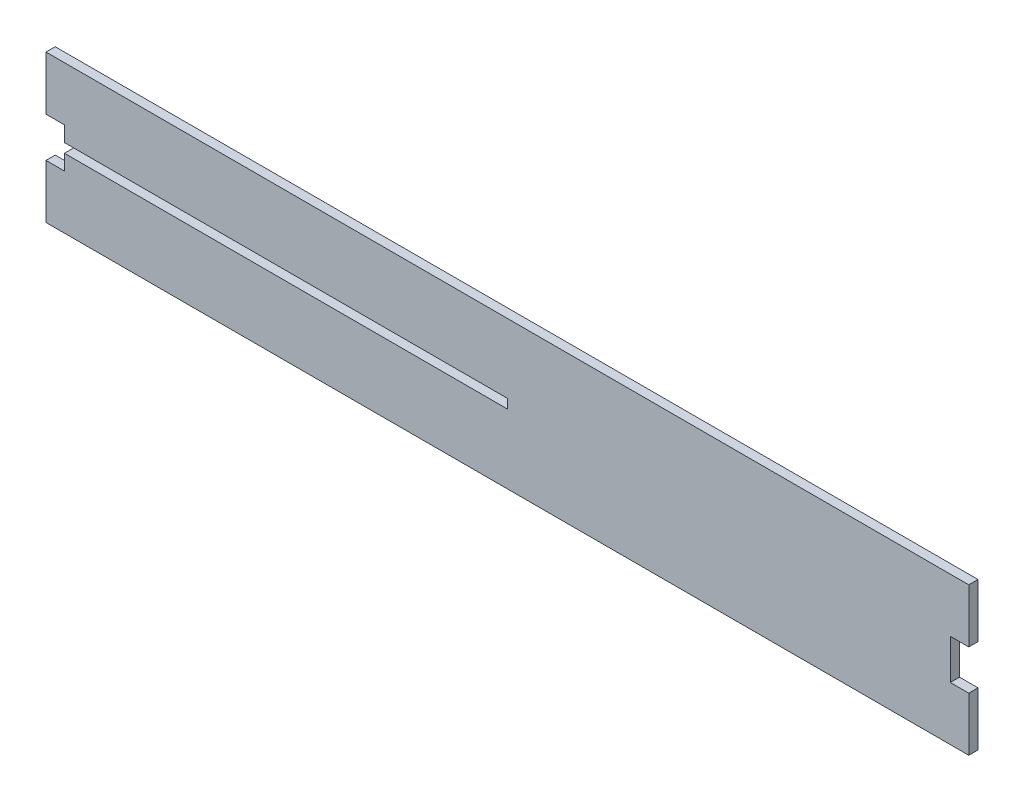
ISO-10303-21;
HEADER;
FILE_DESCRIPTION(('STEP AP214'),'2;1');
FILE_NAME('part.step','',(''),(''),'','','');
FILE_SCHEMA(('AUTOMOTIVE_DESIGN { 1 0 10303 214 1 1 1 1 }'));
ENDSEC;
DATA;
#1=APPLICATION_CONTEXT('core data for automotive mechanical design processes');
#2=APPLICATION_PROTOCOL_DEFINITION('international standard','automotive_design',2000,#1);
#3=PRODUCT_CONTEXT('',#1,'mechanical');
#4=PRODUCT('Part','Part','',(#3));
#5=PRODUCT_RELATED_PRODUCT_CATEGORY('part','',(#4));
#6=PRODUCT_DEFINITION_FORMATION('','',#4);
#7=PRODUCT_DEFINITION_CONTEXT('part definition',#1,'design');
#8=PRODUCT_DEFINITION('design','',#6,#7);
#9=PRODUCT_DEFINITION_SHAPE('','',#8);
#10=(LENGTH_UNIT() NAMED_UNIT(*) SI_UNIT(.MILLI.,.METRE.));
#11=(NAMED_UNIT(*) PLANE_ANGLE_UNIT() SI_UNIT($,.RADIAN.));
#12=(NAMED_UNIT(*) SI_UNIT($,.STERADIAN.) SOLID_ANGLE_UNIT());
#13=UNCERTAINTY_MEASURE_WITH_UNIT(LENGTH_MEASURE(1.E-05),#10,'distance_accuracy_value','');
#14=(GEOMETRIC_REPRESENTATION_CONTEXT(3) GLOBAL_UNCERTAINTY_ASSIGNED_CONTEXT((#13)) GLOBAL_UNIT_ASSIGNED_CONTEXT((#10,
#11,#12)) REPRESENTATION_CONTEXT('',''));
#15=CARTESIAN_POINT('',(0.,0.,0.));
#16=DIRECTION('',(0.,0.,1.));
#17=DIRECTION('',(1.,0.,0.));
#18=AXIS2_PLACEMENT_3D('',#15,#16,#17);
#19=CARTESIAN_POINT('',(0.,6.49999999999995,3.));
#20=DIRECTION('',(0.,1.,0.));
#21=DIRECTION('',(0.,0.,1.));
#22=AXIS2_PLACEMENT_3D('',#19,#20,#21);
#23=PLANE('',#22);
#24=DIRECTION('',(1.,0.,0.));
#25=VECTOR('',#24,1.);
#26=CARTESIAN_POINT('',(0.,6.49999999999995,0.));
#27=LINE('',#26,#25);
#28=CARTESIAN_POINT('',(143.999999981011,6.49999999999995,0.));
#29=VERTEX_POINT('',#28);
#30=CARTESIAN_POINT('',(150.,6.49999999999995,0.));
#31=VERTEX_POINT('',#30);
#32=EDGE_CURVE('E177',#29,#31,#27,.T.);
#33=ORIENTED_EDGE('',*,*,#32,.T.);
#34=DIRECTION('',(0.,0.,-1.));
#35=VECTOR('',#34,1.);
#36=CARTESIAN_POINT('',(150.,6.49999999999995,3.));
#37=LINE('',#36,#35);
#38=CARTESIAN_POINT('',(150.,6.49999999999995,3.));
#39=VERTEX_POINT('',#38);
#40=EDGE_CURVE('E11',#39,#31,#37,.T.);
#41=ORIENTED_EDGE('',*,*,#40,.F.);
#42=DIRECTION('',(1.,0.,0.));
#43=VECTOR('',#42,1.);
#44=CARTESIAN_POINT('',(0.,6.49999999999995,3.));
#45=LINE('',#44,#43);
#46=CARTESIAN_POINT('',(143.999999981011,6.49999999999995,3.));
#47=VERTEX_POINT('',#46);
#48=EDGE_CURVE('E218',#47,#39,#45,.T.);
#49=ORIENTED_EDGE('',*,*,#48,.F.);
#50=DIRECTION('',(0.,0.,-1.));
#51=VECTOR('',#50,1.);
#52=CARTESIAN_POINT('',(143.999999981011,6.49999999999995,3.));
#53=LINE('',#52,#51);
#54=EDGE_CURVE('E173',#47,#29,#53,.T.);
#55=ORIENTED_EDGE('',*,*,#54,.T.);
#56=EDGE_LOOP('',(#33,#41,#49,#55));
#57=FACE_BOUND('',#56,.T.);
#58=ADVANCED_FACE('F34',(#57),#23,.F.);
#59=CARTESIAN_POINT('',(150.,0.,3.));
#60=DIRECTION('',(-1.,0.,0.));
#61=DIRECTION('',(0.,0.,1.));
#62=AXIS2_PLACEMENT_3D('',#59,#60,#61);
#63=PLANE('',#62);
#64=DIRECTION('',(0.,1.,0.));
#65=VECTOR('',#64,1.);
#66=CARTESIAN_POINT('',(150.,0.,0.));
#67=LINE('',#66,#65);
#68=CARTESIAN_POINT('',(150.,24.,0.));
#69=VERTEX_POINT('',#68);
#70=EDGE_CURVE('E180',#31,#69,#67,.T.);
#71=ORIENTED_EDGE('',*,*,#70,.T.);
#72=DIRECTION('',(0.,0.,-1.));
#73=VECTOR('',#72,1.);
#74=CARTESIAN_POINT('',(150.,24.,3.));
#75=LINE('',#74,#73);
#76=CARTESIAN_POINT('',(150.,24.,3.));
#77=VERTEX_POINT('',#76);
#78=EDGE_CURVE('E42',#77,#69,#75,.T.);
#79=ORIENTED_EDGE('',*,*,#78,.F.);
#80=DIRECTION('',(0.,1.,0.));
#81=VECTOR('',#80,1.);
#82=CARTESIAN_POINT('',(150.,0.,3.));
#83=LINE('',#82,#81);
#84=EDGE_CURVE('E113',#39,#77,#83,.T.);
#85=ORIENTED_EDGE('',*,*,#84,.F.);
#86=ORIENTED_EDGE('',*,*,#40,.T.);
#87=EDGE_LOOP('',(#71,#79,#85,#86));
#88=FACE_BOUND('',#87,.T.);
#89=ADVANCED_FACE('F302',(#88),#63,.F.);
#90=CARTESIAN_POINT('',(0.,23.9999999999999,3.));
#91=DIRECTION('',(0.,-1.,0.));
#92=DIRECTION('',(1.,0.,0.));
#93=AXIS2_PLACEMENT_3D('',#90,#91,#92);
#94=PLANE('',#93);
#95=DIRECTION('',(-1.,0.,0.));
#96=VECTOR('',#95,1.);
#97=CARTESIAN_POINT('',(0.,23.9999999999999,0.));
#98=LINE('',#97,#96);
#99=CARTESIAN_POINT('',(-150.,23.9999999999999,0.));
#100=VERTEX_POINT('',#99);
#101=EDGE_CURVE('E182',#69,#100,#98,.T.);
#102=ORIENTED_EDGE('',*,*,#101,.T.);
#103=DIRECTION('',(0.,0.,-1.));
#104=VECTOR('',#103,1.);
#105=CARTESIAN_POINT('',(-150.,23.9999999999999,3.));
#106=LINE('',#105,#104);
#107=CARTESIAN_POINT('',(-150.,23.9999999999999,3.));
#108=VERTEX_POINT('',#107);
#109=EDGE_CURVE('E241',#108,#100,#106,.T.);
#110=ORIENTED_EDGE('',*,*,#109,.F.);
#111=DIRECTION('',(-1.,0.,0.));
#112=VECTOR('',#111,1.);
#113=CARTESIAN_POINT('',(0.,23.9999999999999,3.));
#114=LINE('',#113,#112);
#115=EDGE_CURVE('E248',#77,#108,#114,.T.);
#116=ORIENTED_EDGE('',*,*,#115,.F.);
#117=ORIENTED_EDGE('',*,*,#78,.T.);
#118=EDGE_LOOP('',(#102,#110,#116,#117));
#119=FACE_BOUND('',#118,.T.);
#120=ADVANCED_FACE('F246',(#119),#94,.F.);
#121=CARTESIAN_POINT('',(-150.,0.,3.));
#122=DIRECTION('',(-1.,0.,0.));
#123=DIRECTION('',(0.,0.,1.));
#124=AXIS2_PLACEMENT_3D('',#121,#122,#123);
#125=PLANE('',#124);
#126=DIRECTION('',(0.,1.,0.));
#127=VECTOR('',#126,1.);
#128=CARTESIAN_POINT('',(-150.,0.,0.));
#129=LINE('',#128,#127);
#130=CARTESIAN_POINT('',(-150.,6.49999999999992,0.));
#131=VERTEX_POINT('',#130);
#132=EDGE_CURVE('E185',#131,#100,#129,.T.);
#133=ORIENTED_EDGE('',*,*,#132,.F.);
#134=DIRECTION('',(0.,0.,-1.));
#135=VECTOR('',#134,1.);
#136=CARTESIAN_POINT('',(-150.,6.49999999999992,3.));
#137=LINE('',#136,#135);
#138=CARTESIAN_POINT('',(-150.,6.49999999999992,3.));
#139=VERTEX_POINT('',#138);
#140=EDGE_CURVE('E239',#139,#131,#137,.T.);
#141=ORIENTED_EDGE('',*,*,#140,.F.);
#142=DIRECTION('',(0.,1.,0.));
#143=VECTOR('',#142,1.);
#144=CARTESIAN_POINT('',(-150.,0.,3.));
#145=LINE('',#144,#143);
#146=EDGE_CURVE('E258',#139,#108,#145,.T.);
#147=ORIENTED_EDGE('',*,*,#146,.T.);
#148=ORIENTED_EDGE('',*,*,#109,.T.);
#149=EDGE_LOOP('',(#133,#141,#147,#148));
#150=FACE_BOUND('',#149,.T.);
#151=ADVANCED_FACE('F255',(#150),#125,.T.);
#152=CARTESIAN_POINT('',(0.,6.49999999999994,3.));
#153=DIRECTION('',(0.,-1.,0.));
#154=DIRECTION('',(1.,0.,0.));
#155=AXIS2_PLACEMENT_3D('',#152,#153,#154);
#156=PLANE('',#155);
#157=DIRECTION('',(-1.,0.,0.));
#158=VECTOR('',#157,1.);
#159=CARTESIAN_POINT('',(0.,6.49999999999994,0.));
#160=LINE('',#159,#158);
#161=CARTESIAN_POINT('',(-143.999999981011,6.49999999999992,0.));
#162=VERTEX_POINT('',#161);
#163=EDGE_CURVE('E188',#162,#131,#160,.T.);
#164=ORIENTED_EDGE('',*,*,#163,.F.);
#165=DIRECTION('',(0.,0.,-1.));
#166=VECTOR('',#165,1.);
#167=CARTESIAN_POINT('',(-143.999999981011,6.49999999999992,3.));
#168=LINE('',#167,#166);
#169=CARTESIAN_POINT('',(-143.999999981011,6.49999999999992,3.));
#170=VERTEX_POINT('',#169);
#171=EDGE_CURVE('E237',#170,#162,#168,.T.);
#172=ORIENTED_EDGE('',*,*,#171,.F.);
#173=DIRECTION('',(-1.,0.,0.));
#174=VECTOR('',#173,1.);
#175=CARTESIAN_POINT('',(0.,6.49999999999994,3.));
#176=LINE('',#175,#174);
#177=EDGE_CURVE('E261',#170,#139,#176,.T.);
#178=ORIENTED_EDGE('',*,*,#177,.T.);
#179=ORIENTED_EDGE('',*,*,#140,.T.);
#180=EDGE_LOOP('',(#164,#172,#178,#179));
#181=FACE_BOUND('',#180,.T.);
#182=ADVANCED_FACE('F313',(#181),#156,.T.);
#183=CARTESIAN_POINT('',(-143.999999981011,7.89881993670657E-13,3.));
#184=DIRECTION('',(-1.,0.,0.));
#185=DIRECTION('',(0.,-1.,0.));
#186=AXIS2_PLACEMENT_3D('',#183,#184,#185);
#187=PLANE('',#186);
#188=DIRECTION('',(0.,1.,0.));
#189=VECTOR('',#188,1.);
#190=CARTESIAN_POINT('',(-143.999999981011,7.89881993670657E-13,0.));
#191=LINE('',#190,#189);
#192=CARTESIAN_POINT('',(-143.999999981011,1.50000189888618,0.));
#193=VERTEX_POINT('',#192);
#194=EDGE_CURVE('E191',#193,#162,#191,.T.);
#195=ORIENTED_EDGE('',*,*,#194,.F.);
#196=DIRECTION('',(0.,0.,-1.));
#197=VECTOR('',#196,1.);
#198=CARTESIAN_POINT('',(-143.999999981011,1.50000189888618,3.));
#199=LINE('',#198,#197);
#200=CARTESIAN_POINT('',(-143.999999981011,1.50000189888618,3.));
#201=VERTEX_POINT('',#200);
#202=EDGE_CURVE('E235',#201,#193,#199,.T.);
#203=ORIENTED_EDGE('',*,*,#202,.F.);
#204=DIRECTION('',(0.,1.,0.));
#205=VECTOR('',#204,1.);
#206=CARTESIAN_POINT('',(-143.999999981011,7.89881993670657E-13,3.));
#207=LINE('',#206,#205);
#208=EDGE_CURVE('E263',#201,#170,#207,.T.);
#209=ORIENTED_EDGE('',*,*,#208,.T.);
#210=ORIENTED_EDGE('',*,*,#171,.T.);
#211=EDGE_LOOP('',(#195,#203,#209,#210));
#212=FACE_BOUND('',#211,.T.);
#213=ADVANCED_FACE('F316',(#212),#187,.T.);
#214=CARTESIAN_POINT('',(0.,1.50000189888618,3.));
#215=DIRECTION('',(0.,-1.,0.));
#216=DIRECTION('',(0.,0.,-1.));
#217=AXIS2_PLACEMENT_3D('',#214,#215,#216);
#218=PLANE('',#217);
#219=DIRECTION('',(-1.,0.,0.));
#220=VECTOR('',#219,1.);
#221=CARTESIAN_POINT('',(0.,1.50000189888618,0.));
#222=LINE('',#221,#220);
#223=CARTESIAN_POINT('',(0.,1.50000189888618,0.));
#224=VERTEX_POINT('',#223);
#225=EDGE_CURVE('E194',#224,#193,#222,.T.);
#226=ORIENTED_EDGE('',*,*,#225,.F.);
#227=DIRECTION('',(0.,0.,-1.));
#228=VECTOR('',#227,1.);
#229=CARTESIAN_POINT('',(0.,1.50000189888618,3.));
#230=LINE('',#229,#228);
#231=CARTESIAN_POINT('',(0.,1.50000189888618,3.));
#232=VERTEX_POINT('',#231);
#233=EDGE_CURVE('E233',#232,#224,#230,.T.);
#234=ORIENTED_EDGE('',*,*,#233,.F.);
#235=DIRECTION('',(-1.,0.,0.));
#236=VECTOR('',#235,1.);
#237=CARTESIAN_POINT('',(0.,1.50000189888618,3.));
#238=LINE('',#237,#236);
#239=EDGE_CURVE('E270',#232,#201,#238,.T.);
#240=ORIENTED_EDGE('',*,*,#239,.T.);
#241=ORIENTED_EDGE('',*,*,#202,.T.);
#242=EDGE_LOOP('',(#226,#234,#240,#241));
#243=FACE_BOUND('',#242,.T.);
#244=ADVANCED_FACE('F320',(#243),#218,.T.);
#245=CARTESIAN_POINT('',(0.,0.,3.));
#246=DIRECTION('',(1.,0.,0.));
#247=DIRECTION('',(0.,1.,0.));
#248=AXIS2_PLACEMENT_3D('',#245,#246,#247);
#249=PLANE('',#248);
#250=DIRECTION('',(0.,-1.,0.));
#251=VECTOR('',#250,1.);
#252=CARTESIAN_POINT('',(0.,0.,0.));
#253=LINE('',#252,#251);
#254=CARTESIAN_POINT('',(0.,-1.49999810111382,0.));
#255=VERTEX_POINT('',#254);
#256=EDGE_CURVE('E197',#224,#255,#253,.T.);
#257=ORIENTED_EDGE('',*,*,#256,.T.);
#258=DIRECTION('',(0.,0.,-1.));
#259=VECTOR('',#258,1.);
#260=CARTESIAN_POINT('',(0.,-1.49999810111382,3.));
#261=LINE('',#260,#259);
#262=CARTESIAN_POINT('',(0.,-1.49999810111382,3.));
#263=VERTEX_POINT('',#262);
#264=EDGE_CURVE('E230',#263,#255,#261,.T.);
#265=ORIENTED_EDGE('',*,*,#264,.F.);
#266=DIRECTION('',(0.,-1.,0.));
#267=VECTOR('',#266,1.);
#268=CARTESIAN_POINT('',(0.,0.,3.));
#269=LINE('',#268,#267);
#270=EDGE_CURVE('E273',#232,#263,#269,.T.);
#271=ORIENTED_EDGE('',*,*,#270,.F.);
#272=ORIENTED_EDGE('',*,*,#233,.T.);
#273=EDGE_LOOP('',(#257,#265,#271,#272));
#274=FACE_BOUND('',#273,.T.);
#275=ADVANCED_FACE('F324',(#274),#249,.F.);
#276=CARTESIAN_POINT('',(0.,-1.49999810111382,3.));
#277=DIRECTION('',(0.,-1.,0.));
#278=DIRECTION('',(0.,0.,-1.));
#279=AXIS2_PLACEMENT_3D('',#276,#277,#278);
#280=PLANE('',#279);
#281=DIRECTION('',(-1.,0.,0.));
#282=VECTOR('',#281,1.);
#283=CARTESIAN_POINT('',(0.,-1.49999810111382,0.));
#284=LINE('',#283,#282);
#285=CARTESIAN_POINT('',(-143.999999981011,-1.49999810111382,0.));
#286=VERTEX_POINT('',#285);
#287=EDGE_CURVE('E199',#255,#286,#284,.T.);
#288=ORIENTED_EDGE('',*,*,#287,.T.);
#289=DIRECTION('',(0.,0.,-1.));
#290=VECTOR('',#289,1.);
#291=CARTESIAN_POINT('',(-143.999999981011,-1.49999810111382,3.));
#292=LINE('',#291,#290);
#293=CARTESIAN_POINT('',(-143.999999981011,-1.49999810111382,3.));
#294=VERTEX_POINT('',#293);
#295=EDGE_CURVE('E228',#294,#286,#292,.T.);
#296=ORIENTED_EDGE('',*,*,#295,.F.);
#297=DIRECTION('',(-1.,0.,0.));
#298=VECTOR('',#297,1.);
#299=CARTESIAN_POINT('',(0.,-1.49999810111382,3.));
#300=LINE('',#299,#298);
#301=EDGE_CURVE('E275',#263,#294,#300,.T.);
#302=ORIENTED_EDGE('',*,*,#301,.F.);
#303=ORIENTED_EDGE('',*,*,#264,.T.);
#304=EDGE_LOOP('',(#288,#296,#302,#303));
#305=FACE_BOUND('',#304,.T.);
#306=ADVANCED_FACE('F328',(#305),#280,.F.);
#307=CARTESIAN_POINT('',(-143.999999981011,0.,3.));
#308=DIRECTION('',(-1.,0.,0.));
#309=DIRECTION('',(0.,0.,1.));
#310=AXIS2_PLACEMENT_3D('',#307,#308,#309);
#311=PLANE('',#310);
#312=DIRECTION('',(0.,1.,0.));
#313=VECTOR('',#312,1.);
#314=CARTESIAN_POINT('',(-143.999999981011,0.,0.));
#315=LINE('',#314,#313);
#316=CARTESIAN_POINT('',(-143.999999981011,-6.50000000000008,0.));
#317=VERTEX_POINT('',#316);
#318=EDGE_CURVE('E202',#317,#286,#315,.T.);
#319=ORIENTED_EDGE('',*,*,#318,.F.);
#320=DIRECTION('',(0.,0.,-1.));
#321=VECTOR('',#320,1.);
#322=CARTESIAN_POINT('',(-143.999999981011,-6.50000000000008,3.));
#323=LINE('',#322,#321);
#324=CARTESIAN_POINT('',(-143.999999981011,-6.50000000000008,3.));
#325=VERTEX_POINT('',#324);
#326=EDGE_CURVE('E226',#325,#317,#323,.T.);
#327=ORIENTED_EDGE('',*,*,#326,.F.);
#328=DIRECTION('',(0.,1.,0.));
#329=VECTOR('',#328,1.);
#330=CARTESIAN_POINT('',(-143.999999981011,0.,3.));
#331=LINE('',#330,#329);
#332=EDGE_CURVE('E277',#325,#294,#331,.T.);
#333=ORIENTED_EDGE('',*,*,#332,.T.);
#334=ORIENTED_EDGE('',*,*,#295,.T.);
#335=EDGE_LOOP('',(#319,#327,#333,#334));
#336=FACE_BOUND('',#335,.T.);
#337=ADVANCED_FACE('F332',(#336),#311,.T.);
#338=CARTESIAN_POINT('',(0.,-6.49999999999999,3.));
#339=DIRECTION('',(0.,-1.,0.));
#340=DIRECTION('',(1.,0.,0.));
#341=AXIS2_PLACEMENT_3D('',#338,#339,#340);
#342=PLANE('',#341);
#343=DIRECTION('',(-1.,0.,0.));
#344=VECTOR('',#343,1.);
#345=CARTESIAN_POINT('',(0.,-6.49999999999999,0.));
#346=LINE('',#345,#344);
#347=CARTESIAN_POINT('',(-150.,-6.50000000000008,0.));
#348=VERTEX_POINT('',#347);
#349=EDGE_CURVE('E205',#317,#348,#346,.T.);
#350=ORIENTED_EDGE('',*,*,#349,.T.);
#351=DIRECTION('',(0.,0.,-1.));
#352=VECTOR('',#351,1.);
#353=CARTESIAN_POINT('',(-150.,-6.50000000000008,3.));
#354=LINE('',#353,#352);
#355=CARTESIAN_POINT('',(-150.,-6.50000000000008,3.));
#356=VERTEX_POINT('',#355);
#357=EDGE_CURVE('E224',#356,#348,#354,.T.);
#358=ORIENTED_EDGE('',*,*,#357,.F.);
#359=DIRECTION('',(-1.,0.,0.));
#360=VECTOR('',#359,1.);
#361=CARTESIAN_POINT('',(0.,-6.49999999999999,3.));
#362=LINE('',#361,#360);
#363=EDGE_CURVE('E280',#325,#356,#362,.T.);
#364=ORIENTED_EDGE('',*,*,#363,.F.);
#365=ORIENTED_EDGE('',*,*,#326,.T.);
#366=EDGE_LOOP('',(#350,#358,#364,#365));
#367=FACE_BOUND('',#366,.T.);
#368=ADVANCED_FACE('F336',(#367),#342,.F.);
#369=CARTESIAN_POINT('',(-150.,0.,3.));
#370=DIRECTION('',(-1.,0.,0.));
#371=DIRECTION('',(0.,0.,1.));
#372=AXIS2_PLACEMENT_3D('',#369,#370,#371);
#373=PLANE('',#372);
#374=DIRECTION('',(0.,1.,0.));
#375=VECTOR('',#374,1.);
#376=CARTESIAN_POINT('',(-150.,0.,0.));
#377=LINE('',#376,#375);
#378=CARTESIAN_POINT('',(-150.,-24.0000000000001,0.));
#379=VERTEX_POINT('',#378);
#380=EDGE_CURVE('E208',#379,#348,#377,.T.);
#381=ORIENTED_EDGE('',*,*,#380,.F.);
#382=DIRECTION('',(0.,0.,-1.));
#383=VECTOR('',#382,1.);
#384=CARTESIAN_POINT('',(-150.,-24.0000000000001,3.));
#385=LINE('',#384,#383);
#386=CARTESIAN_POINT('',(-150.,-24.0000000000001,3.));
#387=VERTEX_POINT('',#386);
#388=EDGE_CURVE('E222',#387,#379,#385,.T.);
#389=ORIENTED_EDGE('',*,*,#388,.F.);
#390=DIRECTION('',(0.,1.,0.));
#391=VECTOR('',#390,1.);
#392=CARTESIAN_POINT('',(-150.,0.,3.));
#393=LINE('',#392,#391);
#394=EDGE_CURVE('E282',#387,#356,#393,.T.);
#395=ORIENTED_EDGE('',*,*,#394,.T.);
#396=ORIENTED_EDGE('',*,*,#357,.T.);
#397=EDGE_LOOP('',(#381,#389,#395,#396));
#398=FACE_BOUND('',#397,.T.);
#399=ADVANCED_FACE('F340',(#398),#373,.T.);
#400=CARTESIAN_POINT('',(0.,-24.,3.));
#401=DIRECTION('',(0.,-1.,0.));
#402=DIRECTION('',(1.,0.,0.));
#403=AXIS2_PLACEMENT_3D('',#400,#401,#402);
#404=PLANE('',#403);
#405=DIRECTION('',(-1.,0.,0.));
#406=VECTOR('',#405,1.);
#407=CARTESIAN_POINT('',(0.,-24.,0.));
#408=LINE('',#407,#406);
#409=CARTESIAN_POINT('',(150.,-23.9999999999999,0.));
#410=VERTEX_POINT('',#409);
#411=EDGE_CURVE('E211',#410,#379,#408,.T.);
#412=ORIENTED_EDGE('',*,*,#411,.F.);
#413=DIRECTION('',(0.,0.,-1.));
#414=VECTOR('',#413,1.);
#415=CARTESIAN_POINT('',(150.,-23.9999999999999,3.));
#416=LINE('',#415,#414);
#417=CARTESIAN_POINT('',(150.,-23.9999999999999,3.));
#418=VERTEX_POINT('',#417);
#419=EDGE_CURVE('E169',#418,#410,#416,.T.);
#420=ORIENTED_EDGE('',*,*,#419,.F.);
#421=DIRECTION('',(-1.,0.,0.));
#422=VECTOR('',#421,1.);
#423=CARTESIAN_POINT('',(0.,-24.,3.));
#424=LINE('',#423,#422);
#425=EDGE_CURVE('E158',#418,#387,#424,.T.);
#426=ORIENTED_EDGE('',*,*,#425,.T.);
#427=ORIENTED_EDGE('',*,*,#388,.T.);
#428=EDGE_LOOP('',(#412,#420,#426,#427));
#429=FACE_BOUND('',#428,.T.);
#430=ADVANCED_FACE('F286',(#429),#404,.T.);
#431=CARTESIAN_POINT('',(150.,0.,3.));
#432=DIRECTION('',(-1.,0.,0.));
#433=DIRECTION('',(0.,0.,1.));
#434=AXIS2_PLACEMENT_3D('',#431,#432,#433);
#435=PLANE('',#434);
#436=DIRECTION('',(0.,1.,0.));
#437=VECTOR('',#436,1.);
#438=CARTESIAN_POINT('',(150.,0.,0.));
#439=LINE('',#438,#437);
#440=CARTESIAN_POINT('',(150.,-6.50000000000004,0.));
#441=VERTEX_POINT('',#440);
#442=EDGE_CURVE('E165',#410,#441,#439,.T.);
#443=ORIENTED_EDGE('',*,*,#442,.T.);
#444=DIRECTION('',(0.,0.,-1.));
#445=VECTOR('',#444,1.);
#446=CARTESIAN_POINT('',(150.,-6.50000000000004,3.));
#447=LINE('',#446,#445);
#448=CARTESIAN_POINT('',(150.,-6.50000000000004,3.));
#449=VERTEX_POINT('',#448);
#450=EDGE_CURVE('E162',#449,#441,#447,.T.);
#451=ORIENTED_EDGE('',*,*,#450,.F.);
#452=DIRECTION('',(0.,1.,0.));
#453=VECTOR('',#452,1.);
#454=CARTESIAN_POINT('',(150.,0.,3.));
#455=LINE('',#454,#453);
#456=EDGE_CURVE('E151',#418,#449,#455,.T.);
#457=ORIENTED_EDGE('',*,*,#456,.F.);
#458=ORIENTED_EDGE('',*,*,#419,.T.);
#459=EDGE_LOOP('',(#443,#451,#457,#458));
#460=FACE_BOUND('',#459,.T.);
#461=ADVANCED_FACE('F163',(#460),#435,.F.);
#462=CARTESIAN_POINT('',(0.,-6.49999999999998,3.));
#463=DIRECTION('',(0.,1.,0.));
#464=DIRECTION('',(-1.,0.,0.));
#465=AXIS2_PLACEMENT_3D('',#462,#463,#464);
#466=PLANE('',#465);
#467=DIRECTION('',(1.,0.,0.));
#468=VECTOR('',#467,1.);
#469=CARTESIAN_POINT('',(0.,-6.49999999999998,0.));
#470=LINE('',#469,#468);
#471=CARTESIAN_POINT('',(143.999999981011,-6.50000000000004,0.));
#472=VERTEX_POINT('',#471);
#473=EDGE_CURVE('E215',#472,#441,#470,.T.);
#474=ORIENTED_EDGE('',*,*,#473,.F.);
#475=DIRECTION('',(0.,0.,-1.));
#476=VECTOR('',#475,1.);
#477=CARTESIAN_POINT('',(143.999999981011,-6.50000000000004,3.));
#478=LINE('',#477,#476);
#479=CARTESIAN_POINT('',(143.999999981011,-6.50000000000004,3.));
#480=VERTEX_POINT('',#479);
#481=EDGE_CURVE('E102',#480,#472,#478,.T.);
#482=ORIENTED_EDGE('',*,*,#481,.F.);
#483=DIRECTION('',(1.,0.,0.));
#484=VECTOR('',#483,1.);
#485=CARTESIAN_POINT('',(0.,-6.49999999999998,3.));
#486=LINE('',#485,#484);
#487=EDGE_CURVE('E155',#480,#449,#486,.T.);
#488=ORIENTED_EDGE('',*,*,#487,.T.);
#489=ORIENTED_EDGE('',*,*,#450,.T.);
#490=EDGE_LOOP('',(#474,#482,#488,#489));
#491=FACE_BOUND('',#490,.T.);
#492=ADVANCED_FACE('F171',(#491),#466,.T.);
#493=CARTESIAN_POINT('',(143.999999981011,0.,3.));
#494=DIRECTION('',(-1.,0.,0.));
#495=DIRECTION('',(0.,0.,1.));
#496=AXIS2_PLACEMENT_3D('',#493,#494,#495);
#497=PLANE('',#496);
#498=DIRECTION('',(0.,1.,0.));
#499=VECTOR('',#498,1.);
#500=CARTESIAN_POINT('',(143.999999981011,0.,0.));
#501=LINE('',#500,#499);
#502=EDGE_CURVE('E105',#472,#29,#501,.T.);
#503=ORIENTED_EDGE('',*,*,#502,.T.);
#504=ORIENTED_EDGE('',*,*,#54,.F.);
#505=DIRECTION('',(0.,1.,0.));
#506=VECTOR('',#505,1.);
#507=CARTESIAN_POINT('',(143.999999981011,0.,3.));
#508=LINE('',#507,#506);
#509=EDGE_CURVE('E50',#480,#47,#508,.T.);
#510=ORIENTED_EDGE('',*,*,#509,.F.);
#511=ORIENTED_EDGE('',*,*,#481,.T.);
#512=EDGE_LOOP('',(#503,#504,#510,#511));
#513=FACE_BOUND('',#512,.T.);
#514=ADVANCED_FACE('F291',(#513),#497,.F.);
#515=CARTESIAN_POINT('',(0.,0.,3.));
#516=DIRECTION('',(0.,0.,1.));
#517=DIRECTION('',(1.,0.,0.));
#518=AXIS2_PLACEMENT_3D('',#515,#516,#517);
#519=PLANE('',#518);
#520=ORIENTED_EDGE('',*,*,#48,.T.);
#521=ORIENTED_EDGE('',*,*,#84,.T.);
#522=ORIENTED_EDGE('',*,*,#115,.T.);
#523=ORIENTED_EDGE('',*,*,#146,.F.);
#524=ORIENTED_EDGE('',*,*,#177,.F.);
#525=ORIENTED_EDGE('',*,*,#208,.F.);
#526=ORIENTED_EDGE('',*,*,#239,.F.);
#527=ORIENTED_EDGE('',*,*,#270,.T.);
#528=ORIENTED_EDGE('',*,*,#301,.T.);
#529=ORIENTED_EDGE('',*,*,#332,.F.);
#530=ORIENTED_EDGE('',*,*,#363,.T.);
#531=ORIENTED_EDGE('',*,*,#394,.F.);
#532=ORIENTED_EDGE('',*,*,#425,.F.);
#533=ORIENTED_EDGE('',*,*,#456,.T.);
#534=ORIENTED_EDGE('',*,*,#487,.F.);
#535=ORIENTED_EDGE('',*,*,#509,.T.);
#536=EDGE_LOOP('',(#520,#521,#522,#523,#524,#525,#526,#527,#528,#529,#530,#531,#532,#533,#534,#535));
#537=FACE_BOUND('',#536,.T.);
#538=ADVANCED_FACE('F153',(#537),#519,.T.);
#539=CARTESIAN_POINT('',(0.,0.,0.));
#540=DIRECTION('',(0.,0.,1.));
#541=DIRECTION('',(1.,0.,0.));
#542=AXIS2_PLACEMENT_3D('',#539,#540,#541);
#543=PLANE('',#542);
#544=ORIENTED_EDGE('',*,*,#32,.F.);
#545=ORIENTED_EDGE('',*,*,#502,.F.);
#546=ORIENTED_EDGE('',*,*,#473,.T.);
#547=ORIENTED_EDGE('',*,*,#442,.F.);
#548=ORIENTED_EDGE('',*,*,#411,.T.);
#549=ORIENTED_EDGE('',*,*,#380,.T.);
#550=ORIENTED_EDGE('',*,*,#349,.F.);
#551=ORIENTED_EDGE('',*,*,#318,.T.);
#552=ORIENTED_EDGE('',*,*,#287,.F.);
#553=ORIENTED_EDGE('',*,*,#256,.F.);
#554=ORIENTED_EDGE('',*,*,#225,.T.);
#555=ORIENTED_EDGE('',*,*,#194,.T.);
#556=ORIENTED_EDGE('',*,*,#163,.T.);
#557=ORIENTED_EDGE('',*,*,#132,.T.);
#558=ORIENTED_EDGE('',*,*,#101,.F.);
#559=ORIENTED_EDGE('',*,*,#70,.F.);
#560=EDGE_LOOP('',(#544,#545,#546,#547,#548,#549,#550,#551,#552,#553,#554,#555,#556,#557,#558,#559));
#561=FACE_BOUND('',#560,.T.);
#562=ADVANCED_FACE('F251',(#561),#543,.F.);
#563=CLOSED_SHELL('',(#58,#89,#120,#151,#182,#213,#244,#275,#306,#337,#368,#399,#430,#461,#492,
#514,#538,#562));
#564=MANIFOLD_SOLID_BREP('B2',#563);
#565=ADVANCED_BREP_SHAPE_REPRESENTATION('',(#18,#564),#14);
#566=SHAPE_DEFINITION_REPRESENTATION(#9,#565);
ENDSEC;
END-ISO-10303-21;
